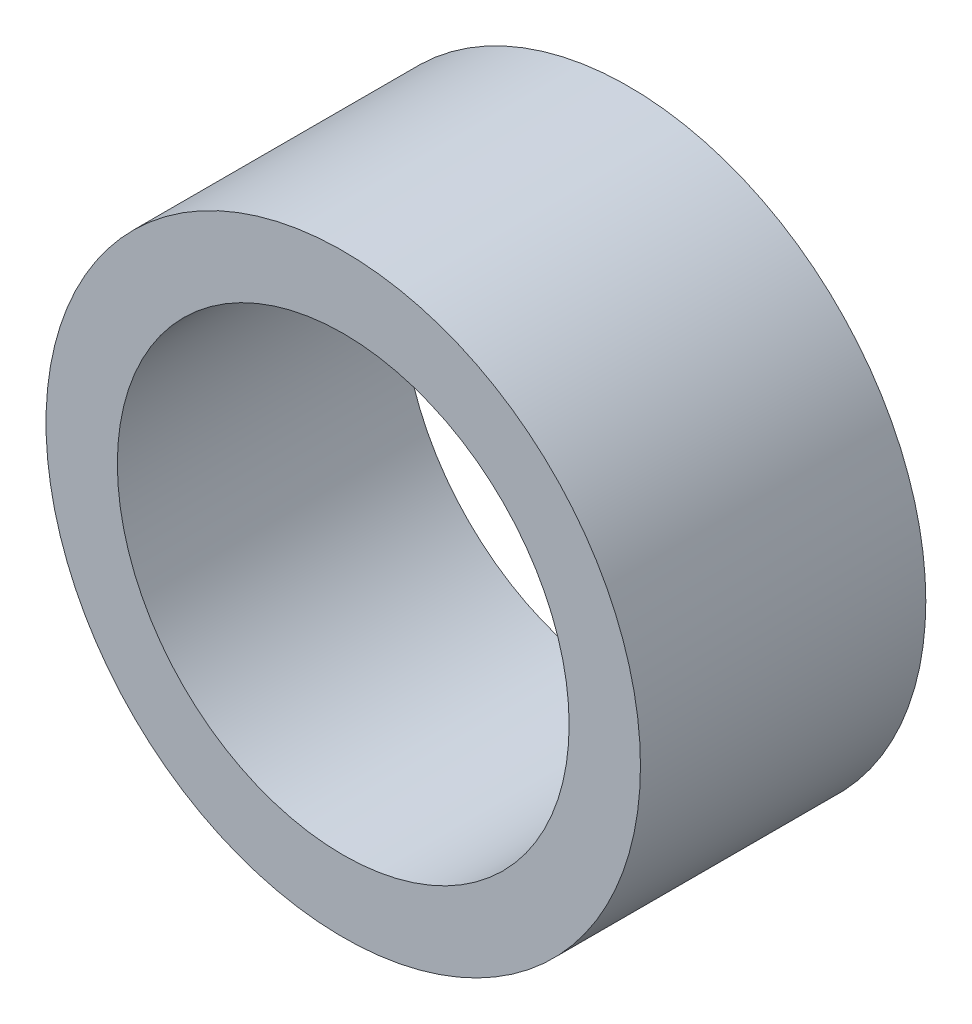
ISO-10303-21;
HEADER;
FILE_DESCRIPTION(('STEP AP214'),'2;1');
FILE_NAME('part.step','',(''),(''),'','','');
FILE_SCHEMA(('AUTOMOTIVE_DESIGN { 1 0 10303 214 1 1 1 1 }'));
ENDSEC;
DATA;
#1=APPLICATION_CONTEXT('core data for automotive mechanical design processes');
#2=APPLICATION_PROTOCOL_DEFINITION('international standard','automotive_design',2000,#1);
#3=PRODUCT_CONTEXT('',#1,'mechanical');
#4=PRODUCT('Part','Part','',(#3));
#5=PRODUCT_RELATED_PRODUCT_CATEGORY('part','',(#4));
#6=PRODUCT_DEFINITION_FORMATION('','',#4);
#7=PRODUCT_DEFINITION_CONTEXT('part definition',#1,'design');
#8=PRODUCT_DEFINITION('design','',#6,#7);
#9=PRODUCT_DEFINITION_SHAPE('','',#8);
#10=(LENGTH_UNIT() NAMED_UNIT(*) SI_UNIT(.MILLI.,.METRE.));
#11=(NAMED_UNIT(*) PLANE_ANGLE_UNIT() SI_UNIT($,.RADIAN.));
#12=(NAMED_UNIT(*) SI_UNIT($,.STERADIAN.) SOLID_ANGLE_UNIT());
#13=UNCERTAINTY_MEASURE_WITH_UNIT(LENGTH_MEASURE(1.E-05),#10,'distance_accuracy_value','');
#14=(GEOMETRIC_REPRESENTATION_CONTEXT(3) GLOBAL_UNCERTAINTY_ASSIGNED_CONTEXT((#13)) GLOBAL_UNIT_ASSIGNED_CONTEXT((#10,
#11,#12)) REPRESENTATION_CONTEXT('',''));
#15=CARTESIAN_POINT('',(0.,0.,0.));
#16=DIRECTION('',(0.,0.,1.));
#17=DIRECTION('',(1.,0.,0.));
#18=AXIS2_PLACEMENT_3D('',#15,#16,#17);
#19=CARTESIAN_POINT('',(0.,0.,2.4));
#20=DIRECTION('',(0.,0.,1.));
#21=DIRECTION('',(1.,0.,0.));
#22=AXIS2_PLACEMENT_3D('',#19,#20,#21);
#23=PLANE('',#22);
#24=CARTESIAN_POINT('',(0.,0.,2.4));
#25=DIRECTION('',(0.,0.,1.));
#26=DIRECTION('',(1.,0.,0.));
#27=AXIS2_PLACEMENT_3D('',#24,#25,#26);
#28=CIRCLE('',#27,2.5);
#29=CARTESIAN_POINT('',(2.5,0.,2.4));
#30=VERTEX_POINT('',#29);
#31=EDGE_CURVE('E10',#30,#30,#28,.T.);
#32=ORIENTED_EDGE('',*,*,#31,.T.);
#33=EDGE_LOOP('',(#32));
#34=FACE_BOUND('',#33,.T.);
#35=CARTESIAN_POINT('',(0.,0.,2.4));
#36=DIRECTION('',(0.,0.,1.));
#37=DIRECTION('',(1.,0.,0.));
#38=AXIS2_PLACEMENT_3D('',#35,#36,#37);
#39=CIRCLE('',#38,1.9);
#40=CARTESIAN_POINT('',(1.9,0.,2.4));
#41=VERTEX_POINT('',#40);
#42=EDGE_CURVE('E48',#41,#41,#39,.T.);
#43=ORIENTED_EDGE('',*,*,#42,.F.);
#44=EDGE_LOOP('',(#43));
#45=FACE_BOUND('',#44,.T.);
#46=ADVANCED_FACE('F37',(#34,#45),#23,.T.);
#47=CARTESIAN_POINT('',(0.,0.,0.));
#48=DIRECTION('',(0.,0.,1.));
#49=DIRECTION('',(1.,0.,0.));
#50=AXIS2_PLACEMENT_3D('',#47,#48,#49);
#51=PLANE('',#50);
#52=CARTESIAN_POINT('',(0.,0.,0.));
#53=DIRECTION('',(0.,0.,1.));
#54=DIRECTION('',(1.,0.,0.));
#55=AXIS2_PLACEMENT_3D('',#52,#53,#54);
#56=CIRCLE('',#55,2.5);
#57=CARTESIAN_POINT('',(2.5,0.,0.));
#58=VERTEX_POINT('',#57);
#59=EDGE_CURVE('E41',#58,#58,#56,.T.);
#60=ORIENTED_EDGE('',*,*,#59,.F.);
#61=EDGE_LOOP('',(#60));
#62=FACE_BOUND('',#61,.T.);
#63=CARTESIAN_POINT('',(0.,0.,0.));
#64=DIRECTION('',(0.,0.,1.));
#65=DIRECTION('',(1.,0.,0.));
#66=AXIS2_PLACEMENT_3D('',#63,#64,#65);
#67=CIRCLE('',#66,1.9);
#68=CARTESIAN_POINT('',(1.9,0.,0.));
#69=VERTEX_POINT('',#68);
#70=EDGE_CURVE('E50',#69,#69,#67,.T.);
#71=ORIENTED_EDGE('',*,*,#70,.T.);
#72=EDGE_LOOP('',(#71));
#73=FACE_BOUND('',#72,.T.);
#74=ADVANCED_FACE('F60',(#62,#73),#51,.F.);
#75=CARTESIAN_POINT('',(0.,0.,2.4));
#76=DIRECTION('',(0.,0.,-1.));
#77=DIRECTION('',(-1.,0.,0.));
#78=AXIS2_PLACEMENT_3D('',#75,#76,#77);
#79=CYLINDRICAL_SURFACE('',#78,2.5);
#80=ORIENTED_EDGE('',*,*,#31,.F.);
#81=EDGE_LOOP('',(#80));
#82=FACE_BOUND('',#81,.T.);
#83=ORIENTED_EDGE('',*,*,#59,.T.);
#84=EDGE_LOOP('',(#83));
#85=FACE_BOUND('',#84,.T.);
#86=ADVANCED_FACE('F39',(#82,#85),#79,.T.);
#87=CARTESIAN_POINT('',(0.,0.,2.4));
#88=DIRECTION('',(0.,0.,-1.));
#89=DIRECTION('',(-1.,0.,0.));
#90=AXIS2_PLACEMENT_3D('',#87,#88,#89);
#91=CYLINDRICAL_SURFACE('',#90,1.9);
#92=ORIENTED_EDGE('',*,*,#42,.T.);
#93=EDGE_LOOP('',(#92));
#94=FACE_BOUND('',#93,.T.);
#95=ORIENTED_EDGE('',*,*,#70,.F.);
#96=EDGE_LOOP('',(#95));
#97=FACE_BOUND('',#96,.T.);
#98=ADVANCED_FACE('F56',(#94,#97),#91,.F.);
#99=CLOSED_SHELL('',(#46,#74,#86,#98));
#100=MANIFOLD_SOLID_BREP('B2',#99);
#101=ADVANCED_BREP_SHAPE_REPRESENTATION('',(#18,#100),#14);
#102=SHAPE_DEFINITION_REPRESENTATION(#9,#101);
ENDSEC;
END-ISO-10303-21;
